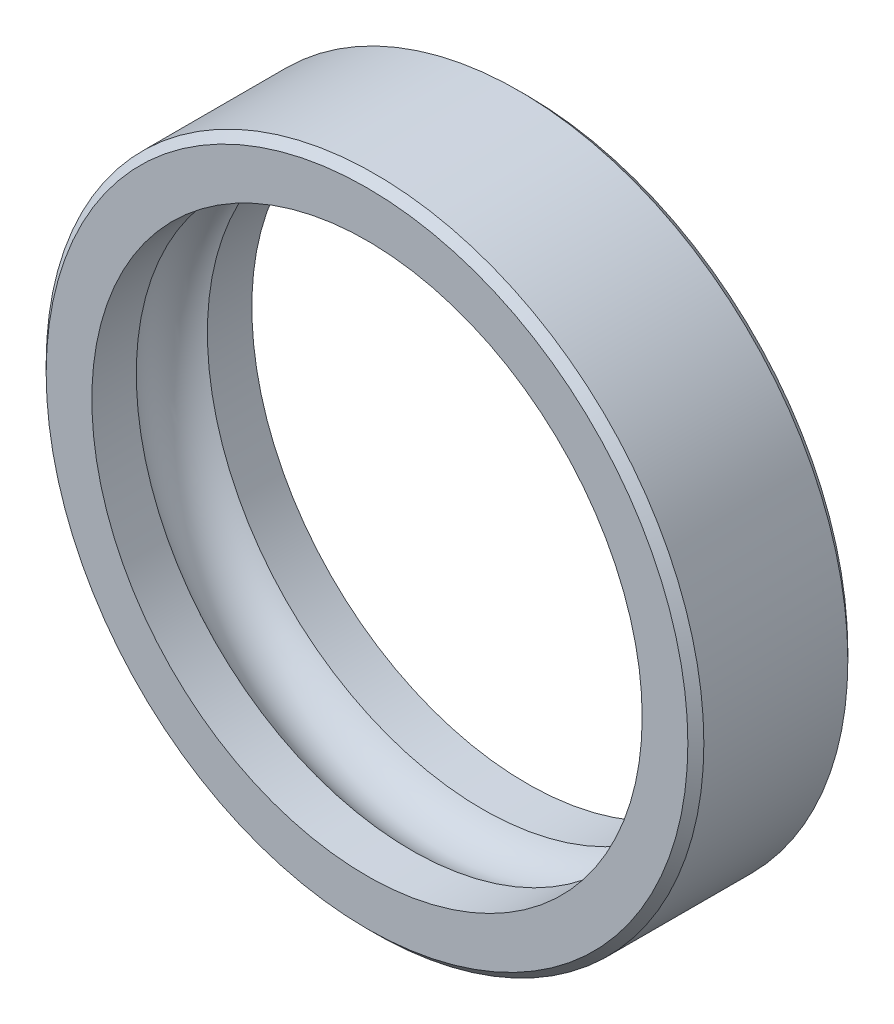
ISO-10303-21;
HEADER;
FILE_DESCRIPTION(('STEP AP214'),'2;1');
FILE_NAME('part.step','',(''),(''),'','','');
FILE_SCHEMA(('AUTOMOTIVE_DESIGN { 1 0 10303 214 1 1 1 1 }'));
ENDSEC;
DATA;
#1=APPLICATION_CONTEXT('core data for automotive mechanical design processes');
#2=APPLICATION_PROTOCOL_DEFINITION('international standard','automotive_design',2000,#1);
#3=PRODUCT_CONTEXT('',#1,'mechanical');
#4=PRODUCT('Part','Part','',(#3));
#5=PRODUCT_RELATED_PRODUCT_CATEGORY('part','',(#4));
#6=PRODUCT_DEFINITION_FORMATION('','',#4);
#7=PRODUCT_DEFINITION_CONTEXT('part definition',#1,'design');
#8=PRODUCT_DEFINITION('design','',#6,#7);
#9=PRODUCT_DEFINITION_SHAPE('','',#8);
#10=(LENGTH_UNIT() NAMED_UNIT(*) SI_UNIT(.MILLI.,.METRE.));
#11=(NAMED_UNIT(*) PLANE_ANGLE_UNIT() SI_UNIT($,.RADIAN.));
#12=(NAMED_UNIT(*) SI_UNIT($,.STERADIAN.) SOLID_ANGLE_UNIT());
#13=UNCERTAINTY_MEASURE_WITH_UNIT(LENGTH_MEASURE(1.E-05),#10,'distance_accuracy_value','');
#14=(GEOMETRIC_REPRESENTATION_CONTEXT(3) GLOBAL_UNCERTAINTY_ASSIGNED_CONTEXT((#13)) GLOBAL_UNIT_ASSIGNED_CONTEXT((#10,
#11,#12)) REPRESENTATION_CONTEXT('',''));
#15=CARTESIAN_POINT('',(0.,0.,0.));
#16=DIRECTION('',(0.,0.,1.));
#17=DIRECTION('',(1.,0.,0.));
#18=AXIS2_PLACEMENT_3D('',#15,#16,#17);
#19=CARTESIAN_POINT('',(0.,18.05,4.5));
#20=DIRECTION('',(0.,0.,-1.));
#21=DIRECTION('',(0.,-1.,0.));
#22=AXIS2_PLACEMENT_3D('',#19,#20,#21);
#23=PLANE('',#22);
#24=CARTESIAN_POINT('',(0.,0.,4.5));
#25=DIRECTION('',(0.,0.,1.));
#26=DIRECTION('',(1.,0.,0.));
#27=AXIS2_PLACEMENT_3D('',#24,#25,#26);
#28=CIRCLE('',#27,15.4807692307692);
#29=CARTESIAN_POINT('',(15.4807692307692,0.,4.5));
#30=VERTEX_POINT('',#29);
#31=EDGE_CURVE('E22',#30,#30,#28,.T.);
#32=ORIENTED_EDGE('',*,*,#31,.F.);
#33=EDGE_LOOP('',(#32));
#34=FACE_BOUND('',#33,.T.);
#35=CARTESIAN_POINT('',(0.,0.,4.5));
#36=DIRECTION('',(0.,0.,-1.));
#37=DIRECTION('',(-1.,0.,0.));
#38=AXIS2_PLACEMENT_3D('',#35,#36,#37);
#39=CIRCLE('',#38,18.05);
#40=CARTESIAN_POINT('',(-18.05,0.,4.5));
#41=VERTEX_POINT('',#40);
#42=EDGE_CURVE('E36',#41,#41,#39,.T.);
#43=ORIENTED_EDGE('',*,*,#42,.F.);
#44=EDGE_LOOP('',(#43));
#45=FACE_BOUND('',#44,.T.);
#46=ADVANCED_FACE('F15',(#34,#45),#23,.F.);
#47=CARTESIAN_POINT('',(0.,18.05,-4.5));
#48=DIRECTION('',(0.,0.,1.));
#49=DIRECTION('',(1.,0.,0.));
#50=AXIS2_PLACEMENT_3D('',#47,#48,#49);
#51=PLANE('',#50);
#52=CARTESIAN_POINT('',(0.,0.,-4.5));
#53=DIRECTION('',(0.,0.,-1.));
#54=DIRECTION('',(1.,0.,0.));
#55=AXIS2_PLACEMENT_3D('',#52,#53,#54);
#56=CIRCLE('',#55,15.4807692307692);
#57=CARTESIAN_POINT('',(15.4807692307692,0.,-4.5));
#58=VERTEX_POINT('',#57);
#59=EDGE_CURVE('E10',#58,#58,#56,.T.);
#60=ORIENTED_EDGE('',*,*,#59,.F.);
#61=EDGE_LOOP('',(#60));
#62=FACE_BOUND('',#61,.T.);
#63=CARTESIAN_POINT('',(0.,0.,-4.5));
#64=DIRECTION('',(0.,0.,1.));
#65=DIRECTION('',(0.,-1.,0.));
#66=AXIS2_PLACEMENT_3D('',#63,#64,#65);
#67=CIRCLE('',#66,18.05);
#68=CARTESIAN_POINT('',(0.,-18.05,-4.5));
#69=VERTEX_POINT('',#68);
#70=EDGE_CURVE('E33',#69,#69,#67,.T.);
#71=ORIENTED_EDGE('',*,*,#70,.F.);
#72=EDGE_LOOP('',(#71));
#73=FACE_BOUND('',#72,.T.);
#74=ADVANCED_FACE('F72',(#62,#73),#51,.F.);
#75=CARTESIAN_POINT('',(0.,0.,4.5));
#76=DIRECTION('',(0.,0.,1.));
#77=DIRECTION('',(1.,0.,0.));
#78=AXIS2_PLACEMENT_3D('',#75,#76,#77);
#79=CYLINDRICAL_SURFACE('',#78,15.4807692307692);
#80=CARTESIAN_POINT('',(0.,0.,-2.));
#81=DIRECTION('',(0.,0.,-1.));
#82=DIRECTION('',(1.,0.,0.));
#83=AXIS2_PLACEMENT_3D('',#80,#81,#82);
#84=CIRCLE('',#83,15.4807692307692);
#85=CARTESIAN_POINT('',(15.4807692307692,0.,-2.));
#86=VERTEX_POINT('',#85);
#87=EDGE_CURVE('E52',#86,#86,#84,.T.);
#88=ORIENTED_EDGE('',*,*,#87,.F.);
#89=EDGE_LOOP('',(#88));
#90=FACE_BOUND('',#89,.T.);
#91=ORIENTED_EDGE('',*,*,#59,.T.);
#92=EDGE_LOOP('',(#91));
#93=FACE_BOUND('',#92,.T.);
#94=ADVANCED_FACE('F76',(#90,#93),#79,.F.);
#95=CARTESIAN_POINT('',(0.,0.,4.5));
#96=DIRECTION('',(0.,0.,1.));
#97=DIRECTION('',(1.,0.,0.));
#98=AXIS2_PLACEMENT_3D('',#95,#96,#97);
#99=CYLINDRICAL_SURFACE('',#98,15.4807692307692);
#100=ORIENTED_EDGE('',*,*,#31,.T.);
#101=EDGE_LOOP('',(#100));
#102=FACE_BOUND('',#101,.T.);
#103=CARTESIAN_POINT('',(0.,0.,2.));
#104=DIRECTION('',(0.,0.,1.));
#105=DIRECTION('',(1.,0.,0.));
#106=AXIS2_PLACEMENT_3D('',#103,#104,#105);
#107=CIRCLE('',#106,15.4807692307692);
#108=CARTESIAN_POINT('',(15.4807692307692,0.,2.));
#109=VERTEX_POINT('',#108);
#110=EDGE_CURVE('E47',#109,#109,#107,.T.);
#111=ORIENTED_EDGE('',*,*,#110,.F.);
#112=EDGE_LOOP('',(#111));
#113=FACE_BOUND('',#112,.T.);
#114=ADVANCED_FACE('F69',(#102,#113),#99,.F.);
#115=CARTESIAN_POINT('',(0.,0.,-4.05));
#116=DIRECTION('',(0.,0.,1.));
#117=DIRECTION('',(0.,-1.,0.));
#118=AXIS2_PLACEMENT_3D('',#115,#116,#117);
#119=CONICAL_SURFACE('',#118,18.5,0.785398163397449);
#120=CARTESIAN_POINT('',(0.,0.,-4.05));
#121=DIRECTION('',(0.,0.,1.));
#122=DIRECTION('',(1.,0.,0.));
#123=AXIS2_PLACEMENT_3D('',#120,#121,#122);
#124=CIRCLE('',#123,18.5);
#125=CARTESIAN_POINT('',(18.5,0.,-4.05));
#126=VERTEX_POINT('',#125);
#127=EDGE_CURVE('E44',#126,#126,#124,.T.);
#128=ORIENTED_EDGE('',*,*,#127,.F.);
#129=EDGE_LOOP('',(#128));
#130=FACE_BOUND('',#129,.T.);
#131=ORIENTED_EDGE('',*,*,#70,.T.);
#132=EDGE_LOOP('',(#131));
#133=FACE_BOUND('',#132,.T.);
#134=ADVANCED_FACE('F66',(#130,#133),#119,.T.);
#135=CARTESIAN_POINT('',(0.,0.,4.05));
#136=DIRECTION('',(0.,0.,-1.));
#137=DIRECTION('',(-1.,0.,0.));
#138=AXIS2_PLACEMENT_3D('',#135,#136,#137);
#139=CONICAL_SURFACE('',#138,18.5,0.785398163397446);
#140=CARTESIAN_POINT('',(0.,0.,4.05));
#141=DIRECTION('',(0.,0.,-1.));
#142=DIRECTION('',(1.,0.,0.));
#143=AXIS2_PLACEMENT_3D('',#140,#141,#142);
#144=CIRCLE('',#143,18.5);
#145=CARTESIAN_POINT('',(18.5,0.,4.05));
#146=VERTEX_POINT('',#145);
#147=EDGE_CURVE('E41',#146,#146,#144,.T.);
#148=ORIENTED_EDGE('',*,*,#147,.F.);
#149=EDGE_LOOP('',(#148));
#150=FACE_BOUND('',#149,.T.);
#151=ORIENTED_EDGE('',*,*,#42,.T.);
#152=EDGE_LOOP('',(#151));
#153=FACE_BOUND('',#152,.T.);
#154=ADVANCED_FACE('F67',(#150,#153),#139,.T.);
#155=CARTESIAN_POINT('',(0.,0.,4.5));
#156=DIRECTION('',(0.,0.,1.));
#157=DIRECTION('',(1.,0.,0.));
#158=AXIS2_PLACEMENT_3D('',#155,#156,#157);
#159=CYLINDRICAL_SURFACE('',#158,18.5);
#160=ORIENTED_EDGE('',*,*,#147,.T.);
#161=EDGE_LOOP('',(#160));
#162=FACE_BOUND('',#161,.T.);
#163=ORIENTED_EDGE('',*,*,#127,.T.);
#164=EDGE_LOOP('',(#163));
#165=FACE_BOUND('',#164,.T.);
#166=ADVANCED_FACE('F63',(#162,#165),#159,.T.);
#167=CARTESIAN_POINT('',(0.,0.,0.));
#168=DIRECTION('',(0.,0.,1.));
#169=DIRECTION('',(0.,-1.,0.));
#170=AXIS2_PLACEMENT_3D('',#167,#168,#169);
#171=TOROIDAL_SURFACE('',#170,14.25,2.3483596188421);
#172=ORIENTED_EDGE('',*,*,#110,.T.);
#173=EDGE_LOOP('',(#172));
#174=FACE_BOUND('',#173,.T.);
#175=ORIENTED_EDGE('',*,*,#87,.T.);
#176=EDGE_LOOP('',(#175));
#177=FACE_BOUND('',#176,.T.);
#178=ADVANCED_FACE('F93',(#174,#177),#171,.F.);
#179=CLOSED_SHELL('',(#46,#74,#94,#114,#134,#154,#166,#178));
#180=MANIFOLD_SOLID_BREP('B1',#179);
#181=ADVANCED_BREP_SHAPE_REPRESENTATION('',(#18,#180),#14);
#182=SHAPE_DEFINITION_REPRESENTATION(#9,#181);
ENDSEC;
END-ISO-10303-21;
